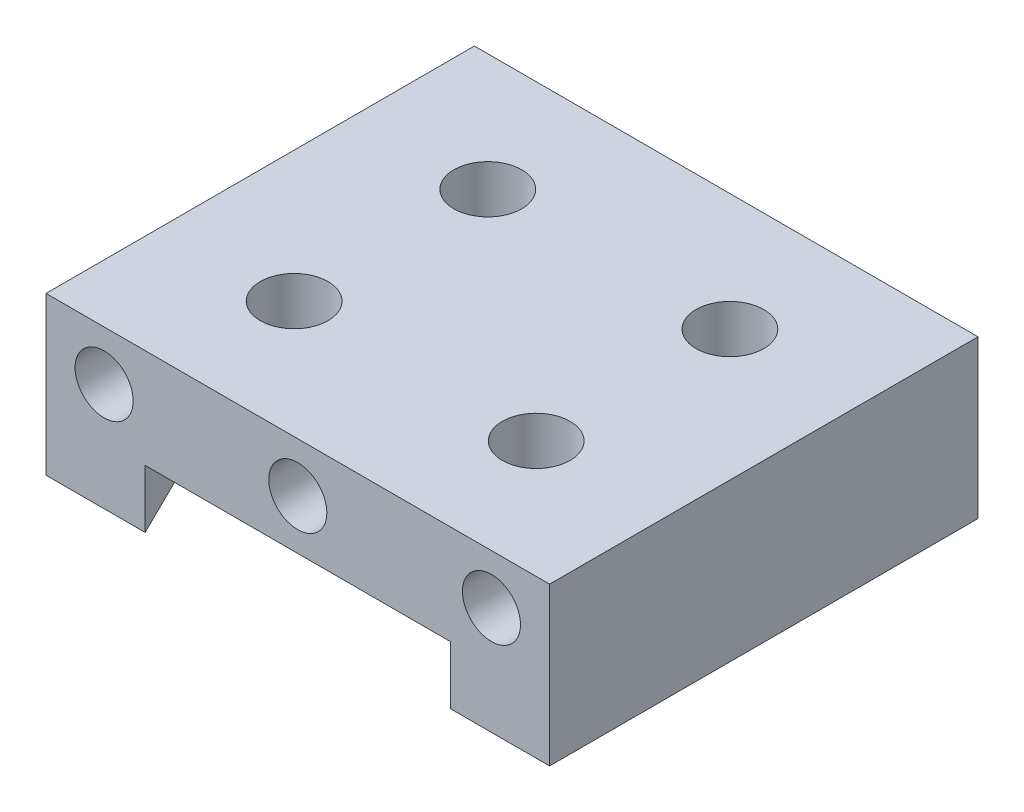
ISO-10303-21;
HEADER;
FILE_DESCRIPTION(('STEP AP214'),'2;1');
FILE_NAME('part.step','',(''),(''),'','','');
FILE_SCHEMA(('AUTOMOTIVE_DESIGN { 1 0 10303 214 1 1 1 1 }'));
ENDSEC;
DATA;
#1=APPLICATION_CONTEXT('core data for automotive mechanical design processes');
#2=APPLICATION_PROTOCOL_DEFINITION('international standard','automotive_design',2000,#1);
#3=PRODUCT_CONTEXT('',#1,'mechanical');
#4=PRODUCT('Part','Part','',(#3));
#5=PRODUCT_RELATED_PRODUCT_CATEGORY('part','',(#4));
#6=PRODUCT_DEFINITION_FORMATION('','',#4);
#7=PRODUCT_DEFINITION_CONTEXT('part definition',#1,'design');
#8=PRODUCT_DEFINITION('design','',#6,#7);
#9=PRODUCT_DEFINITION_SHAPE('','',#8);
#10=(LENGTH_UNIT() NAMED_UNIT(*) SI_UNIT(.MILLI.,.METRE.));
#11=(NAMED_UNIT(*) PLANE_ANGLE_UNIT() SI_UNIT($,.RADIAN.));
#12=(NAMED_UNIT(*) SI_UNIT($,.STERADIAN.) SOLID_ANGLE_UNIT());
#13=UNCERTAINTY_MEASURE_WITH_UNIT(LENGTH_MEASURE(1.E-05),#10,'distance_accuracy_value','');
#14=(GEOMETRIC_REPRESENTATION_CONTEXT(3) GLOBAL_UNCERTAINTY_ASSIGNED_CONTEXT((#13)) GLOBAL_UNIT_ASSIGNED_CONTEXT((#10,
#11,#12)) REPRESENTATION_CONTEXT('',''));
#15=CARTESIAN_POINT('',(0.,0.,0.));
#16=DIRECTION('',(0.,0.,1.));
#17=DIRECTION('',(1.,0.,0.));
#18=AXIS2_PLACEMENT_3D('',#15,#16,#17);
#19=CARTESIAN_POINT('',(0.,0.,0.));
#20=DIRECTION('',(0.,1.,0.));
#21=DIRECTION('',(0.,0.,1.));
#22=AXIS2_PLACEMENT_3D('',#19,#20,#21);
#23=PLANE('',#22);
#24=CARTESIAN_POINT('',(6.25,0.,-5.));
#25=DIRECTION('',(0.,1.,0.));
#26=DIRECTION('',(0.,0.,1.));
#27=AXIS2_PLACEMENT_3D('',#24,#25,#26);
#28=CIRCLE('',#27,1.75);
#29=CARTESIAN_POINT('',(6.25,0.,-3.25));
#30=VERTEX_POINT('',#29);
#31=EDGE_CURVE('E326',#30,#30,#28,.F.);
#32=ORIENTED_EDGE('',*,*,#31,.F.);
#33=EDGE_LOOP('',(#32));
#34=FACE_BOUND('',#33,.T.);
#35=CARTESIAN_POINT('',(-6.25,0.,-5.));
#36=DIRECTION('',(0.,1.,0.));
#37=DIRECTION('',(0.,0.,1.));
#38=AXIS2_PLACEMENT_3D('',#35,#36,#37);
#39=CIRCLE('',#38,1.75);
#40=CARTESIAN_POINT('',(-6.25,0.,-3.25));
#41=VERTEX_POINT('',#40);
#42=EDGE_CURVE('E260',#41,#41,#39,.T.);
#43=ORIENTED_EDGE('',*,*,#42,.T.);
#44=EDGE_LOOP('',(#43));
#45=FACE_BOUND('',#44,.T.);
#46=CARTESIAN_POINT('',(-6.25,0.,5.));
#47=DIRECTION('',(0.,1.,0.));
#48=DIRECTION('',(0.,0.,1.));
#49=AXIS2_PLACEMENT_3D('',#46,#47,#48);
#50=CIRCLE('',#49,1.75);
#51=CARTESIAN_POINT('',(-6.25,0.,6.75));
#52=VERTEX_POINT('',#51);
#53=EDGE_CURVE('E258',#52,#52,#50,.T.);
#54=ORIENTED_EDGE('',*,*,#53,.T.);
#55=EDGE_LOOP('',(#54));
#56=FACE_BOUND('',#55,.T.);
#57=CARTESIAN_POINT('',(6.25,0.,4.99999999999999));
#58=DIRECTION('',(0.,1.,0.));
#59=DIRECTION('',(0.,0.,1.));
#60=AXIS2_PLACEMENT_3D('',#57,#58,#59);
#61=CIRCLE('',#60,1.75);
#62=CARTESIAN_POINT('',(6.25,0.,6.74999999999999));
#63=VERTEX_POINT('',#62);
#64=EDGE_CURVE('E261',#63,#63,#61,.F.);
#65=ORIENTED_EDGE('',*,*,#64,.F.);
#66=EDGE_LOOP('',(#65));
#67=FACE_BOUND('',#66,.T.);
#68=DIRECTION('',(1.,0.,0.));
#69=VECTOR('',#68,1.);
#70=CARTESIAN_POINT('',(0.,0.,-11.06));
#71=LINE('',#70,#69);
#72=CARTESIAN_POINT('',(-11.035,0.,-11.06));
#73=VERTEX_POINT('',#72);
#74=CARTESIAN_POINT('',(11.035,0.,-11.06));
#75=VERTEX_POINT('',#74);
#76=EDGE_CURVE('E264',#73,#75,#71,.T.);
#77=ORIENTED_EDGE('',*,*,#76,.T.);
#78=DIRECTION('',(0.0436121701625857,0.,0.999048536665617));
#79=VECTOR('',#78,1.);
#80=CARTESIAN_POINT('',(11.4959028570884,0.,-0.501838752748907));
#81=LINE('',#80,#79);
#82=CARTESIAN_POINT('',(11.63,0.,2.57));
#83=VERTEX_POINT('',#82);
#84=EDGE_CURVE('E167',#75,#83,#81,.T.);
#85=ORIENTED_EDGE('',*,*,#84,.T.);
#86=CARTESIAN_POINT('',(11.63,0.,2.57));
#87=CARTESIAN_POINT('',(11.3494527302674,0.,3.75846749150916));
#88=CARTESIAN_POINT('',(10.92,0.,4.9));
#89=B_SPLINE_CURVE_WITH_KNOTS('',2,(#86,#87,#88),.UNSPECIFIED.,.F.,.F.,(3,3),(0.,1.),.UNSPECIFIED.);
#90=CARTESIAN_POINT('',(10.92,0.,4.9));
#91=VERTEX_POINT('',#90);
#92=EDGE_CURVE('E132',#83,#91,#89,.T.);
#93=ORIENTED_EDGE('',*,*,#92,.T.);
#94=DIRECTION('',(-0.442373846562707,0.,0.896830742045184));
#95=VECTOR('',#94,1.);
#96=CARTESIAN_POINT('',(10.7270136271239,0.,5.29124399721158));
#97=LINE('',#96,#95);
#98=CARTESIAN_POINT('',(7.88149700598802,0.,11.06));
#99=VERTEX_POINT('',#98);
#100=EDGE_CURVE('E146',#91,#99,#97,.T.);
#101=ORIENTED_EDGE('',*,*,#100,.T.);
#102=DIRECTION('',(1.,0.,0.));
#103=VECTOR('',#102,1.);
#104=CARTESIAN_POINT('',(0.,0.,11.06));
#105=LINE('',#104,#103);
#106=CARTESIAN_POINT('',(-7.88149700598802,0.,11.06));
#107=VERTEX_POINT('',#106);
#108=EDGE_CURVE('E278',#107,#99,#105,.T.);
#109=ORIENTED_EDGE('',*,*,#108,.F.);
#110=DIRECTION('',(-0.442373846562707,0.,-0.896830742045184));
#111=VECTOR('',#110,1.);
#112=CARTESIAN_POINT('',(-10.7270136271239,0.,5.29124399721158));
#113=LINE('',#112,#111);
#114=CARTESIAN_POINT('',(-10.92,0.,4.9));
#115=VERTEX_POINT('',#114);
#116=EDGE_CURVE('E39',#107,#115,#113,.T.);
#117=ORIENTED_EDGE('',*,*,#116,.T.);
#118=CARTESIAN_POINT('',(-11.63,0.,2.57));
#119=CARTESIAN_POINT('',(-11.3494527302674,0.,3.75846749150916));
#120=CARTESIAN_POINT('',(-10.92,0.,4.9));
#121=B_SPLINE_CURVE_WITH_KNOTS('',2,(#118,#119,#120),.UNSPECIFIED.,.F.,.F.,(3,3),(0.,1.),.UNSPECIFIED.);
#122=CARTESIAN_POINT('',(-11.63,0.,2.57));
#123=VERTEX_POINT('',#122);
#124=EDGE_CURVE('E53',#123,#115,#121,.T.);
#125=ORIENTED_EDGE('',*,*,#124,.F.);
#126=DIRECTION('',(-0.0436121701625857,0.,0.999048536665617));
#127=VECTOR('',#126,1.);
#128=CARTESIAN_POINT('',(-11.4959028570884,0.,-0.501838752748907));
#129=LINE('',#128,#127);
#130=EDGE_CURVE('E58',#73,#123,#129,.T.);
#131=ORIENTED_EDGE('',*,*,#130,.F.);
#132=EDGE_LOOP('',(#77,#85,#93,#101,#109,#117,#125,#131));
#133=FACE_BOUND('',#132,.T.);
#134=ADVANCED_FACE('F35',(#34,#45,#56,#67,#133),#23,.F.);
#135=CARTESIAN_POINT('',(13.,5.13,0.));
#136=DIRECTION('',(1.,0.,0.));
#137=DIRECTION('',(0.,0.,-1.));
#138=AXIS2_PLACEMENT_3D('',#135,#136,#137);
#139=PLANE('',#138);
#140=DIRECTION('',(0.,-1.,0.));
#141=VECTOR('',#140,1.);
#142=CARTESIAN_POINT('',(13.,5.13,11.06));
#143=LINE('',#142,#141);
#144=CARTESIAN_POINT('',(13.,5.13,11.06));
#145=VERTEX_POINT('',#144);
#146=CARTESIAN_POINT('',(13.,-3.,11.06));
#147=VERTEX_POINT('',#146);
#148=EDGE_CURVE('E343',#145,#147,#143,.T.);
#149=ORIENTED_EDGE('',*,*,#148,.T.);
#150=DIRECTION('',(0.,0.,1.));
#151=VECTOR('',#150,1.);
#152=CARTESIAN_POINT('',(13.,-3.,0.));
#153=LINE('',#152,#151);
#154=CARTESIAN_POINT('',(13.,-3.,-11.06));
#155=VERTEX_POINT('',#154);
#156=EDGE_CURVE('E152',#155,#147,#153,.T.);
#157=ORIENTED_EDGE('',*,*,#156,.F.);
#158=DIRECTION('',(0.,-1.,0.));
#159=VECTOR('',#158,1.);
#160=CARTESIAN_POINT('',(13.,5.13,-11.06));
#161=LINE('',#160,#159);
#162=CARTESIAN_POINT('',(13.,5.13,-11.06));
#163=VERTEX_POINT('',#162);
#164=EDGE_CURVE('E11',#163,#155,#161,.T.);
#165=ORIENTED_EDGE('',*,*,#164,.F.);
#166=DIRECTION('',(0.,0.,1.));
#167=VECTOR('',#166,1.);
#168=CARTESIAN_POINT('',(13.,5.13,0.));
#169=LINE('',#168,#167);
#170=EDGE_CURVE('E331',#163,#145,#169,.T.);
#171=ORIENTED_EDGE('',*,*,#170,.T.);
#172=EDGE_LOOP('',(#149,#157,#165,#171));
#173=FACE_BOUND('',#172,.T.);
#174=ADVANCED_FACE('F222',(#173),#139,.T.);
#175=CARTESIAN_POINT('',(0.,5.13,-11.06));
#176=DIRECTION('',(0.,0.,-1.));
#177=DIRECTION('',(-1.,0.,0.));
#178=AXIS2_PLACEMENT_3D('',#175,#176,#177);
#179=PLANE('',#178);
#180=CARTESIAN_POINT('',(10.,2.565,-11.06));
#181=DIRECTION('',(0.,0.,-1.));
#182=DIRECTION('',(-1.,0.,0.));
#183=AXIS2_PLACEMENT_3D('',#180,#181,#182);
#184=CIRCLE('',#183,1.5);
#185=CARTESIAN_POINT('',(8.5,2.565,-11.06));
#186=VERTEX_POINT('',#185);
#187=EDGE_CURVE('E302',#186,#186,#184,.F.);
#188=ORIENTED_EDGE('',*,*,#187,.T.);
#189=EDGE_LOOP('',(#188));
#190=FACE_BOUND('',#189,.T.);
#191=CARTESIAN_POINT('',(-10.,2.565,-11.06));
#192=DIRECTION('',(0.,0.,-1.));
#193=DIRECTION('',(-1.,0.,0.));
#194=AXIS2_PLACEMENT_3D('',#191,#192,#193);
#195=CIRCLE('',#194,1.5);
#196=CARTESIAN_POINT('',(-11.5,2.565,-11.06));
#197=VERTEX_POINT('',#196);
#198=EDGE_CURVE('E310',#197,#197,#195,.F.);
#199=ORIENTED_EDGE('',*,*,#198,.T.);
#200=EDGE_LOOP('',(#199));
#201=FACE_BOUND('',#200,.T.);
#202=CARTESIAN_POINT('',(0.,2.565,-11.06));
#203=DIRECTION('',(0.,0.,-1.));
#204=DIRECTION('',(-1.,0.,0.));
#205=AXIS2_PLACEMENT_3D('',#202,#203,#204);
#206=CIRCLE('',#205,1.5);
#207=CARTESIAN_POINT('',(-1.5,2.565,-11.06));
#208=VERTEX_POINT('',#207);
#209=EDGE_CURVE('E316',#208,#208,#206,.F.);
#210=ORIENTED_EDGE('',*,*,#209,.T.);
#211=EDGE_LOOP('',(#210));
#212=FACE_BOUND('',#211,.T.);
#213=ORIENTED_EDGE('',*,*,#76,.F.);
#214=DIRECTION('',(0.,1.,0.));
#215=VECTOR('',#214,1.);
#216=CARTESIAN_POINT('',(-11.035,-3.,-11.06));
#217=LINE('',#216,#215);
#218=CARTESIAN_POINT('',(-11.035,-3.,-11.06));
#219=VERTEX_POINT('',#218);
#220=EDGE_CURVE('E282',#219,#73,#217,.T.);
#221=ORIENTED_EDGE('',*,*,#220,.F.);
#222=DIRECTION('',(1.,0.,0.));
#223=VECTOR('',#222,1.);
#224=CARTESIAN_POINT('',(0.,-3.,-11.06));
#225=LINE('',#224,#223);
#226=CARTESIAN_POINT('',(-13.,-3.,-11.06));
#227=VERTEX_POINT('',#226);
#228=EDGE_CURVE('E286',#227,#219,#225,.T.);
#229=ORIENTED_EDGE('',*,*,#228,.F.);
#230=DIRECTION('',(0.,-1.,0.));
#231=VECTOR('',#230,1.);
#232=CARTESIAN_POINT('',(-13.,5.13,-11.06));
#233=LINE('',#232,#231);
#234=CARTESIAN_POINT('',(-13.,5.13,-11.06));
#235=VERTEX_POINT('',#234);
#236=EDGE_CURVE('E45',#235,#227,#233,.T.);
#237=ORIENTED_EDGE('',*,*,#236,.F.);
#238=DIRECTION('',(1.,0.,0.));
#239=VECTOR('',#238,1.);
#240=CARTESIAN_POINT('',(0.,5.13,-11.06));
#241=LINE('',#240,#239);
#242=EDGE_CURVE('E334',#235,#163,#241,.T.);
#243=ORIENTED_EDGE('',*,*,#242,.T.);
#244=ORIENTED_EDGE('',*,*,#164,.T.);
#245=DIRECTION('',(1.,0.,0.));
#246=VECTOR('',#245,1.);
#247=CARTESIAN_POINT('',(0.,-3.,-11.06));
#248=LINE('',#247,#246);
#249=CARTESIAN_POINT('',(11.035,-3.,-11.06));
#250=VERTEX_POINT('',#249);
#251=EDGE_CURVE('E150',#250,#155,#248,.T.);
#252=ORIENTED_EDGE('',*,*,#251,.F.);
#253=DIRECTION('',(0.,1.,0.));
#254=VECTOR('',#253,1.);
#255=CARTESIAN_POINT('',(11.035,-3.,-11.06));
#256=LINE('',#255,#254);
#257=EDGE_CURVE('E137',#250,#75,#256,.T.);
#258=ORIENTED_EDGE('',*,*,#257,.T.);
#259=EDGE_LOOP('',(#213,#221,#229,#237,#243,#244,#252,#258));
#260=FACE_BOUND('',#259,.T.);
#261=ADVANCED_FACE('F235',(#190,#201,#212,#260),#179,.T.);
#262=CARTESIAN_POINT('',(-13.,5.13,0.));
#263=DIRECTION('',(1.,0.,0.));
#264=DIRECTION('',(0.,0.,-1.));
#265=AXIS2_PLACEMENT_3D('',#262,#263,#264);
#266=PLANE('',#265);
#267=ORIENTED_EDGE('',*,*,#236,.T.);
#268=DIRECTION('',(0.,0.,-1.));
#269=VECTOR('',#268,1.);
#270=CARTESIAN_POINT('',(-13.,-3.,0.));
#271=LINE('',#270,#269);
#272=CARTESIAN_POINT('',(-13.,-3.,11.06));
#273=VERTEX_POINT('',#272);
#274=EDGE_CURVE('E356',#273,#227,#271,.T.);
#275=ORIENTED_EDGE('',*,*,#274,.F.);
#276=DIRECTION('',(0.,-1.,0.));
#277=VECTOR('',#276,1.);
#278=CARTESIAN_POINT('',(-13.,5.13,11.06));
#279=LINE('',#278,#277);
#280=CARTESIAN_POINT('',(-13.,5.13,11.06));
#281=VERTEX_POINT('',#280);
#282=EDGE_CURVE('E346',#281,#273,#279,.T.);
#283=ORIENTED_EDGE('',*,*,#282,.F.);
#284=DIRECTION('',(0.,0.,1.));
#285=VECTOR('',#284,1.);
#286=CARTESIAN_POINT('',(-13.,5.13,0.));
#287=LINE('',#286,#285);
#288=EDGE_CURVE('E337',#235,#281,#287,.T.);
#289=ORIENTED_EDGE('',*,*,#288,.F.);
#290=EDGE_LOOP('',(#267,#275,#283,#289));
#291=FACE_BOUND('',#290,.T.);
#292=ADVANCED_FACE('F231',(#291),#266,.F.);
#293=CARTESIAN_POINT('',(0.,5.13,11.06));
#294=DIRECTION('',(0.,0.,-1.));
#295=DIRECTION('',(-1.,0.,0.));
#296=AXIS2_PLACEMENT_3D('',#293,#294,#295);
#297=PLANE('',#296);
#298=CARTESIAN_POINT('',(10.,2.565,11.06));
#299=DIRECTION('',(0.,0.,1.));
#300=DIRECTION('',(-1.,0.,0.));
#301=AXIS2_PLACEMENT_3D('',#298,#299,#300);
#302=CIRCLE('',#301,1.5);
#303=CARTESIAN_POINT('',(8.5,2.565,11.06));
#304=VERTEX_POINT('',#303);
#305=EDGE_CURVE('E307',#304,#304,#302,.T.);
#306=ORIENTED_EDGE('',*,*,#305,.F.);
#307=EDGE_LOOP('',(#306));
#308=FACE_BOUND('',#307,.T.);
#309=CARTESIAN_POINT('',(-10.,2.565,11.06));
#310=DIRECTION('',(0.,0.,1.));
#311=DIRECTION('',(1.,0.,0.));
#312=AXIS2_PLACEMENT_3D('',#309,#310,#311);
#313=CIRCLE('',#312,1.5);
#314=CARTESIAN_POINT('',(-8.5,2.565,11.06));
#315=VERTEX_POINT('',#314);
#316=EDGE_CURVE('E313',#315,#315,#313,.T.);
#317=ORIENTED_EDGE('',*,*,#316,.F.);
#318=EDGE_LOOP('',(#317));
#319=FACE_BOUND('',#318,.T.);
#320=CARTESIAN_POINT('',(0.,2.565,11.06));
#321=DIRECTION('',(0.,0.,1.));
#322=DIRECTION('',(1.,0.,0.));
#323=AXIS2_PLACEMENT_3D('',#320,#321,#322);
#324=CIRCLE('',#323,1.5);
#325=CARTESIAN_POINT('',(1.5,2.565,11.06));
#326=VERTEX_POINT('',#325);
#327=EDGE_CURVE('E267',#326,#326,#324,.T.);
#328=ORIENTED_EDGE('',*,*,#327,.F.);
#329=EDGE_LOOP('',(#328));
#330=FACE_BOUND('',#329,.T.);
#331=ORIENTED_EDGE('',*,*,#282,.T.);
#332=DIRECTION('',(-1.,0.,0.));
#333=VECTOR('',#332,1.);
#334=CARTESIAN_POINT('',(0.,-3.,11.06));
#335=LINE('',#334,#333);
#336=CARTESIAN_POINT('',(-7.88149700598802,-3.,11.06));
#337=VERTEX_POINT('',#336);
#338=EDGE_CURVE('E365',#337,#273,#335,.T.);
#339=ORIENTED_EDGE('',*,*,#338,.F.);
#340=DIRECTION('',(0.,1.,0.));
#341=VECTOR('',#340,1.);
#342=CARTESIAN_POINT('',(-7.88149700598802,-3.,11.06));
#343=LINE('',#342,#341);
#344=EDGE_CURVE('E285',#337,#107,#343,.T.);
#345=ORIENTED_EDGE('',*,*,#344,.T.);
#346=ORIENTED_EDGE('',*,*,#108,.T.);
#347=DIRECTION('',(0.,1.,0.));
#348=VECTOR('',#347,1.);
#349=CARTESIAN_POINT('',(7.88149700598802,-3.,11.06));
#350=LINE('',#349,#348);
#351=CARTESIAN_POINT('',(7.88149700598802,-3.,11.06));
#352=VERTEX_POINT('',#351);
#353=EDGE_CURVE('E175',#352,#99,#350,.T.);
#354=ORIENTED_EDGE('',*,*,#353,.F.);
#355=DIRECTION('',(-1.,0.,0.));
#356=VECTOR('',#355,1.);
#357=CARTESIAN_POINT('',(0.,-3.,11.06));
#358=LINE('',#357,#356);
#359=EDGE_CURVE('E160',#147,#352,#358,.T.);
#360=ORIENTED_EDGE('',*,*,#359,.F.);
#361=ORIENTED_EDGE('',*,*,#148,.F.);
#362=DIRECTION('',(1.,0.,0.));
#363=VECTOR('',#362,1.);
#364=CARTESIAN_POINT('',(0.,5.13,11.06));
#365=LINE('',#364,#363);
#366=EDGE_CURVE('E340',#281,#145,#365,.T.);
#367=ORIENTED_EDGE('',*,*,#366,.F.);
#368=EDGE_LOOP('',(#331,#339,#345,#346,#354,#360,#361,#367));
#369=FACE_BOUND('',#368,.T.);
#370=ADVANCED_FACE('F227',(#308,#319,#330,#369),#297,.F.);
#371=CARTESIAN_POINT('',(-6.25,5.13,-5.));
#372=DIRECTION('',(0.,-1.,0.));
#373=DIRECTION('',(0.,0.,-1.));
#374=AXIS2_PLACEMENT_3D('',#371,#372,#373);
#375=CYLINDRICAL_SURFACE('',#374,1.75);
#376=CARTESIAN_POINT('',(-6.25,5.13,-5.));
#377=DIRECTION('',(0.,1.,0.));
#378=DIRECTION('',(0.,0.,1.));
#379=AXIS2_PLACEMENT_3D('',#376,#377,#378);
#380=CIRCLE('',#379,1.75);
#381=CARTESIAN_POINT('',(-6.25,5.13,-3.25));
#382=VERTEX_POINT('',#381);
#383=EDGE_CURVE('E328',#382,#382,#380,.T.);
#384=ORIENTED_EDGE('',*,*,#383,.T.);
#385=EDGE_LOOP('',(#384));
#386=FACE_BOUND('',#385,.T.);
#387=ORIENTED_EDGE('',*,*,#42,.F.);
#388=EDGE_LOOP('',(#387));
#389=FACE_BOUND('',#388,.T.);
#390=ADVANCED_FACE('F230',(#386,#389),#375,.F.);
#391=CARTESIAN_POINT('',(-6.25,5.13,5.));
#392=DIRECTION('',(0.,-1.,0.));
#393=DIRECTION('',(0.,0.,-1.));
#394=AXIS2_PLACEMENT_3D('',#391,#392,#393);
#395=CYLINDRICAL_SURFACE('',#394,1.75);
#396=CARTESIAN_POINT('',(-6.25,5.13,5.));
#397=DIRECTION('',(0.,1.,0.));
#398=DIRECTION('',(0.,0.,1.));
#399=AXIS2_PLACEMENT_3D('',#396,#397,#398);
#400=CIRCLE('',#399,1.75);
#401=CARTESIAN_POINT('',(-6.25,5.13,6.75));
#402=VERTEX_POINT('',#401);
#403=EDGE_CURVE('E255',#402,#402,#400,.T.);
#404=ORIENTED_EDGE('',*,*,#403,.T.);
#405=EDGE_LOOP('',(#404));
#406=FACE_BOUND('',#405,.T.);
#407=ORIENTED_EDGE('',*,*,#53,.F.);
#408=EDGE_LOOP('',(#407));
#409=FACE_BOUND('',#408,.T.);
#410=ADVANCED_FACE('F244',(#406,#409),#395,.F.);
#411=CARTESIAN_POINT('',(6.25,5.13,4.99999999999999));
#412=DIRECTION('',(0.,-1.,0.));
#413=DIRECTION('',(0.,0.,-1.));
#414=AXIS2_PLACEMENT_3D('',#411,#412,#413);
#415=CYLINDRICAL_SURFACE('',#414,1.75);
#416=CARTESIAN_POINT('',(6.25,5.13,4.99999999999999));
#417=DIRECTION('',(0.,1.,0.));
#418=DIRECTION('',(0.,0.,1.));
#419=AXIS2_PLACEMENT_3D('',#416,#417,#418);
#420=CIRCLE('',#419,1.75);
#421=CARTESIAN_POINT('',(6.25,5.13,6.74999999999999));
#422=VERTEX_POINT('',#421);
#423=EDGE_CURVE('E323',#422,#422,#420,.F.);
#424=ORIENTED_EDGE('',*,*,#423,.F.);
#425=EDGE_LOOP('',(#424));
#426=FACE_BOUND('',#425,.T.);
#427=ORIENTED_EDGE('',*,*,#64,.T.);
#428=EDGE_LOOP('',(#427));
#429=FACE_BOUND('',#428,.T.);
#430=ADVANCED_FACE('F37',(#426,#429),#415,.F.);
#431=CARTESIAN_POINT('',(6.25,5.13,-5.));
#432=DIRECTION('',(0.,-1.,0.));
#433=DIRECTION('',(0.,0.,-1.));
#434=AXIS2_PLACEMENT_3D('',#431,#432,#433);
#435=CYLINDRICAL_SURFACE('',#434,1.75);
#436=CARTESIAN_POINT('',(6.25,5.13,-5.));
#437=DIRECTION('',(0.,1.,0.));
#438=DIRECTION('',(0.,0.,1.));
#439=AXIS2_PLACEMENT_3D('',#436,#437,#438);
#440=CIRCLE('',#439,1.75);
#441=CARTESIAN_POINT('',(6.25,5.13,-3.25));
#442=VERTEX_POINT('',#441);
#443=EDGE_CURVE('E341',#442,#442,#440,.F.);
#444=ORIENTED_EDGE('',*,*,#443,.F.);
#445=EDGE_LOOP('',(#444));
#446=FACE_BOUND('',#445,.T.);
#447=ORIENTED_EDGE('',*,*,#31,.T.);
#448=EDGE_LOOP('',(#447));
#449=FACE_BOUND('',#448,.T.);
#450=ADVANCED_FACE('F218',(#446,#449),#435,.F.);
#451=CARTESIAN_POINT('',(0.,5.13,0.));
#452=DIRECTION('',(0.,1.,0.));
#453=DIRECTION('',(0.,0.,1.));
#454=AXIS2_PLACEMENT_3D('',#451,#452,#453);
#455=PLANE('',#454);
#456=ORIENTED_EDGE('',*,*,#423,.T.);
#457=EDGE_LOOP('',(#456));
#458=FACE_BOUND('',#457,.T.);
#459=ORIENTED_EDGE('',*,*,#403,.F.);
#460=EDGE_LOOP('',(#459));
#461=FACE_BOUND('',#460,.T.);
#462=ORIENTED_EDGE('',*,*,#383,.F.);
#463=EDGE_LOOP('',(#462));
#464=FACE_BOUND('',#463,.T.);
#465=ORIENTED_EDGE('',*,*,#170,.F.);
#466=ORIENTED_EDGE('',*,*,#242,.F.);
#467=ORIENTED_EDGE('',*,*,#288,.T.);
#468=ORIENTED_EDGE('',*,*,#366,.T.);
#469=EDGE_LOOP('',(#465,#466,#467,#468));
#470=FACE_BOUND('',#469,.T.);
#471=ORIENTED_EDGE('',*,*,#443,.T.);
#472=EDGE_LOOP('',(#471));
#473=FACE_BOUND('',#472,.T.);
#474=ADVANCED_FACE('F214',(#458,#461,#464,#470,#473),#455,.T.);
#475=CARTESIAN_POINT('',(0.,2.565,-11.061));
#476=DIRECTION('',(0.,0.,1.));
#477=DIRECTION('',(1.,0.,0.));
#478=AXIS2_PLACEMENT_3D('',#475,#476,#477);
#479=CYLINDRICAL_SURFACE('',#478,1.5);
#480=ORIENTED_EDGE('',*,*,#209,.F.);
#481=EDGE_LOOP('',(#480));
#482=FACE_BOUND('',#481,.T.);
#483=ORIENTED_EDGE('',*,*,#327,.T.);
#484=EDGE_LOOP('',(#483));
#485=FACE_BOUND('',#484,.T.);
#486=ADVANCED_FACE('F210',(#482,#485),#479,.F.);
#487=CARTESIAN_POINT('',(-10.,2.565,-11.061));
#488=DIRECTION('',(0.,0.,1.));
#489=DIRECTION('',(1.,0.,0.));
#490=AXIS2_PLACEMENT_3D('',#487,#488,#489);
#491=CYLINDRICAL_SURFACE('',#490,1.5);
#492=ORIENTED_EDGE('',*,*,#198,.F.);
#493=EDGE_LOOP('',(#492));
#494=FACE_BOUND('',#493,.T.);
#495=ORIENTED_EDGE('',*,*,#316,.T.);
#496=EDGE_LOOP('',(#495));
#497=FACE_BOUND('',#496,.T.);
#498=ADVANCED_FACE('F206',(#494,#497),#491,.F.);
#499=CARTESIAN_POINT('',(10.,2.565,-11.061));
#500=DIRECTION('',(0.,0.,1.));
#501=DIRECTION('',(1.,0.,0.));
#502=AXIS2_PLACEMENT_3D('',#499,#500,#501);
#503=CYLINDRICAL_SURFACE('',#502,1.5);
#504=ORIENTED_EDGE('',*,*,#187,.F.);
#505=EDGE_LOOP('',(#504));
#506=FACE_BOUND('',#505,.T.);
#507=ORIENTED_EDGE('',*,*,#305,.T.);
#508=EDGE_LOOP('',(#507));
#509=FACE_BOUND('',#508,.T.);
#510=ADVANCED_FACE('F202',(#506,#509),#503,.F.);
#511=CARTESIAN_POINT('',(-11.4959028570884,-3.,-0.501838752748907));
#512=DIRECTION('',(-0.999048536665616,0.,-0.0436121701625857));
#513=DIRECTION('',(-0.0436121701625857,0.,0.999048536665617));
#514=AXIS2_PLACEMENT_3D('',#511,#512,#513);
#515=PLANE('',#514);
#516=ORIENTED_EDGE('',*,*,#130,.T.);
#517=DIRECTION('',(0.,1.,0.));
#518=VECTOR('',#517,1.);
#519=CARTESIAN_POINT('',(-11.63,-3.,2.57));
#520=LINE('',#519,#518);
#521=CARTESIAN_POINT('',(-11.63,-3.,2.57));
#522=VERTEX_POINT('',#521);
#523=EDGE_CURVE('E297',#522,#123,#520,.T.);
#524=ORIENTED_EDGE('',*,*,#523,.F.);
#525=DIRECTION('',(-0.0436121701625857,0.,0.999048536665617));
#526=VECTOR('',#525,1.);
#527=CARTESIAN_POINT('',(-11.4959028570884,-3.,-0.501838752748907));
#528=LINE('',#527,#526);
#529=EDGE_CURVE('E178',#219,#522,#528,.T.);
#530=ORIENTED_EDGE('',*,*,#529,.F.);
#531=ORIENTED_EDGE('',*,*,#220,.T.);
#532=EDGE_LOOP('',(#516,#524,#530,#531));
#533=FACE_BOUND('',#532,.T.);
#534=ADVANCED_FACE('F197',(#533),#515,.F.);
#535=CARTESIAN_POINT('',(-11.63,-3.,2.57));
#536=CARTESIAN_POINT('',(-11.3494527302674,-3.,3.75846749150916));
#537=CARTESIAN_POINT('',(-10.92,-3.,4.9));
#538=B_SPLINE_CURVE_WITH_KNOTS('',2,(#535,#536,#537),.UNSPECIFIED.,.F.,.F.,(3,3),(0.,1.),.UNSPECIFIED.);
#539=DIRECTION('',(0.,1.,0.));
#540=VECTOR('',#539,1.);
#541=SURFACE_OF_LINEAR_EXTRUSION('',#538,#540);
#542=ORIENTED_EDGE('',*,*,#124,.T.);
#543=DIRECTION('',(0.,1.,0.));
#544=VECTOR('',#543,1.);
#545=CARTESIAN_POINT('',(-10.92,-3.,4.9));
#546=LINE('',#545,#544);
#547=CARTESIAN_POINT('',(-10.92,-3.,4.9));
#548=VERTEX_POINT('',#547);
#549=EDGE_CURVE('E290',#548,#115,#546,.T.);
#550=ORIENTED_EDGE('',*,*,#549,.F.);
#551=EDGE_CURVE('E181',#522,#548,#538,.T.);
#552=ORIENTED_EDGE('',*,*,#551,.F.);
#553=ORIENTED_EDGE('',*,*,#523,.T.);
#554=EDGE_LOOP('',(#542,#550,#552,#553));
#555=FACE_BOUND('',#554,.T.);
#556=ADVANCED_FACE('F192',(#555),#541,.F.);
#557=CARTESIAN_POINT('',(-10.7270136271239,-3.,5.29124399721158));
#558=DIRECTION('',(0.896830742045184,0.,-0.442373846562707));
#559=DIRECTION('',(-0.442373846562707,0.,-0.896830742045184));
#560=AXIS2_PLACEMENT_3D('',#557,#558,#559);
#561=PLANE('',#560);
#562=ORIENTED_EDGE('',*,*,#116,.F.);
#563=ORIENTED_EDGE('',*,*,#344,.F.);
#564=DIRECTION('',(-0.442373846562707,0.,-0.896830742045184));
#565=VECTOR('',#564,1.);
#566=CARTESIAN_POINT('',(-10.7270136271239,-3.,5.29124399721158));
#567=LINE('',#566,#565);
#568=EDGE_CURVE('E186',#337,#548,#567,.T.);
#569=ORIENTED_EDGE('',*,*,#568,.T.);
#570=ORIENTED_EDGE('',*,*,#549,.T.);
#571=EDGE_LOOP('',(#562,#563,#569,#570));
#572=FACE_BOUND('',#571,.T.);
#573=ADVANCED_FACE('F196',(#572),#561,.T.);
#574=CARTESIAN_POINT('',(0.,-3.,0.));
#575=DIRECTION('',(0.,-1.,0.));
#576=DIRECTION('',(0.,0.,-1.));
#577=AXIS2_PLACEMENT_3D('',#574,#575,#576);
#578=PLANE('',#577);
#579=ORIENTED_EDGE('',*,*,#529,.T.);
#580=ORIENTED_EDGE('',*,*,#551,.T.);
#581=ORIENTED_EDGE('',*,*,#568,.F.);
#582=ORIENTED_EDGE('',*,*,#338,.T.);
#583=ORIENTED_EDGE('',*,*,#274,.T.);
#584=ORIENTED_EDGE('',*,*,#228,.T.);
#585=EDGE_LOOP('',(#579,#580,#581,#582,#583,#584));
#586=FACE_BOUND('',#585,.T.);
#587=ADVANCED_FACE('F362',(#586),#578,.T.);
#588=CARTESIAN_POINT('',(11.63,-3.,2.57));
#589=CARTESIAN_POINT('',(11.3494527302674,-3.,3.75846749150916));
#590=CARTESIAN_POINT('',(10.92,-3.,4.9));
#591=B_SPLINE_CURVE_WITH_KNOTS('',2,(#588,#589,#590),.UNSPECIFIED.,.F.,.F.,(3,3),(0.,1.),.UNSPECIFIED.);
#592=DIRECTION('',(0.,1.,0.));
#593=VECTOR('',#592,1.);
#594=SURFACE_OF_LINEAR_EXTRUSION('',#591,#593);
#595=ORIENTED_EDGE('',*,*,#92,.F.);
#596=DIRECTION('',(0.,1.,0.));
#597=VECTOR('',#596,1.);
#598=CARTESIAN_POINT('',(11.63,-3.,2.57));
#599=LINE('',#598,#597);
#600=CARTESIAN_POINT('',(11.63,-3.,2.57));
#601=VERTEX_POINT('',#600);
#602=EDGE_CURVE('E126',#601,#83,#599,.T.);
#603=ORIENTED_EDGE('',*,*,#602,.F.);
#604=CARTESIAN_POINT('',(10.92,-3.,4.9));
#605=VERTEX_POINT('',#604);
#606=EDGE_CURVE('E129',#601,#605,#591,.T.);
#607=ORIENTED_EDGE('',*,*,#606,.T.);
#608=DIRECTION('',(0.,1.,0.));
#609=VECTOR('',#608,1.);
#610=CARTESIAN_POINT('',(10.92,-3.,4.9));
#611=LINE('',#610,#609);
#612=EDGE_CURVE('E163',#605,#91,#611,.T.);
#613=ORIENTED_EDGE('',*,*,#612,.T.);
#614=EDGE_LOOP('',(#595,#603,#607,#613));
#615=FACE_BOUND('',#614,.T.);
#616=ADVANCED_FACE('F128',(#615),#594,.T.);
#617=CARTESIAN_POINT('',(11.4959028570884,-3.,-0.501838752748907));
#618=DIRECTION('',(-0.999048536665616,0.,0.0436121701625857));
#619=DIRECTION('',(0.0436121701625857,0.,0.999048536665617));
#620=AXIS2_PLACEMENT_3D('',#617,#618,#619);
#621=PLANE('',#620);
#622=ORIENTED_EDGE('',*,*,#84,.F.);
#623=ORIENTED_EDGE('',*,*,#257,.F.);
#624=DIRECTION('',(0.0436121701625857,0.,0.999048536665617));
#625=VECTOR('',#624,1.);
#626=CARTESIAN_POINT('',(11.4959028570884,-3.,-0.501838752748907));
#627=LINE('',#626,#625);
#628=EDGE_CURVE('E143',#250,#601,#627,.T.);
#629=ORIENTED_EDGE('',*,*,#628,.T.);
#630=ORIENTED_EDGE('',*,*,#602,.T.);
#631=EDGE_LOOP('',(#622,#623,#629,#630));
#632=FACE_BOUND('',#631,.T.);
#633=ADVANCED_FACE('F148',(#632),#621,.T.);
#634=CARTESIAN_POINT('',(10.7270136271239,-3.,5.29124399721158));
#635=DIRECTION('',(-0.896830742045184,0.,-0.442373846562707));
#636=DIRECTION('',(-0.442373846562707,0.,0.896830742045184));
#637=AXIS2_PLACEMENT_3D('',#634,#635,#636);
#638=PLANE('',#637);
#639=ORIENTED_EDGE('',*,*,#100,.F.);
#640=ORIENTED_EDGE('',*,*,#612,.F.);
#641=DIRECTION('',(-0.442373846562707,0.,0.896830742045184));
#642=VECTOR('',#641,1.);
#643=CARTESIAN_POINT('',(10.7270136271239,-3.,5.29124399721158));
#644=LINE('',#643,#642);
#645=EDGE_CURVE('E145',#605,#352,#644,.T.);
#646=ORIENTED_EDGE('',*,*,#645,.T.);
#647=ORIENTED_EDGE('',*,*,#353,.T.);
#648=EDGE_LOOP('',(#639,#640,#646,#647));
#649=FACE_BOUND('',#648,.T.);
#650=ADVANCED_FACE('F381',(#649),#638,.T.);
#651=CARTESIAN_POINT('',(0.,-3.,0.));
#652=DIRECTION('',(0.,-1.,0.));
#653=DIRECTION('',(0.,0.,-1.));
#654=AXIS2_PLACEMENT_3D('',#651,#652,#653);
#655=PLANE('',#654);
#656=ORIENTED_EDGE('',*,*,#606,.F.);
#657=ORIENTED_EDGE('',*,*,#628,.F.);
#658=ORIENTED_EDGE('',*,*,#251,.T.);
#659=ORIENTED_EDGE('',*,*,#156,.T.);
#660=ORIENTED_EDGE('',*,*,#359,.T.);
#661=ORIENTED_EDGE('',*,*,#645,.F.);
#662=EDGE_LOOP('',(#656,#657,#658,#659,#660,#661));
#663=FACE_BOUND('',#662,.T.);
#664=ADVANCED_FACE('F141',(#663),#655,.T.);
#665=CLOSED_SHELL('',(#134,#174,#261,#292,#370,#390,#410,#430,#450,#474,#486,#498,#510,#534,
#556,#573,#587,#616,#633,#650,#664));
#666=MANIFOLD_SOLID_BREP('B2',#665);
#667=ADVANCED_BREP_SHAPE_REPRESENTATION('',(#18,#666),#14);
#668=SHAPE_DEFINITION_REPRESENTATION(#9,#667);
ENDSEC;
END-ISO-10303-21;
